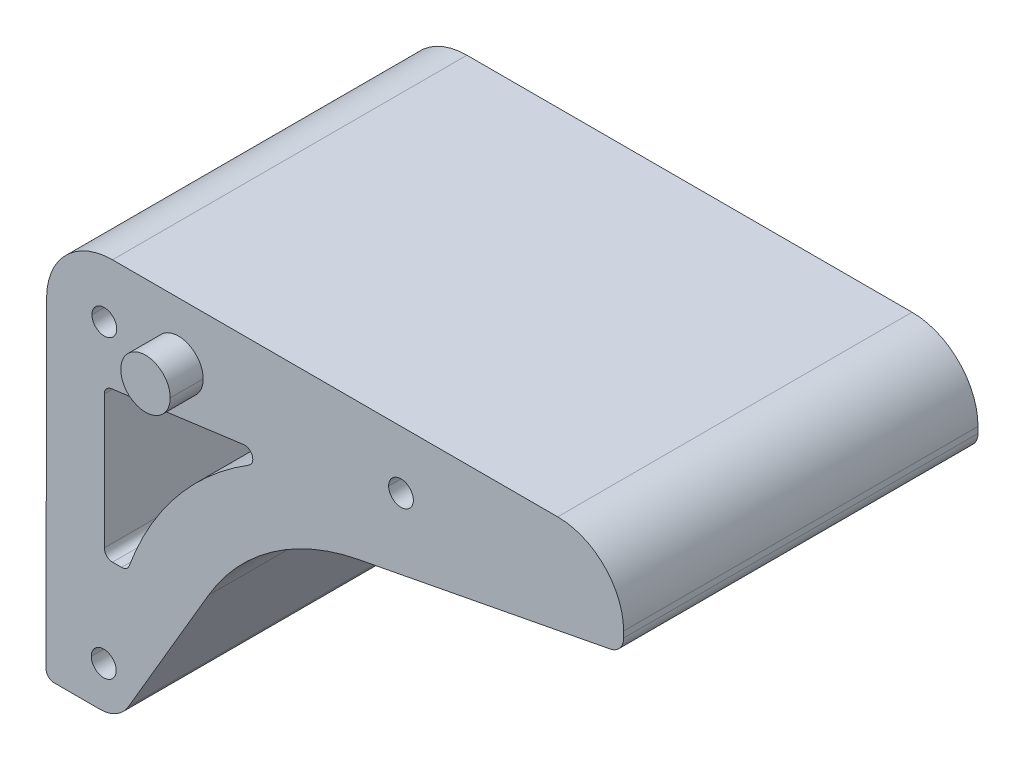
ISO-10303-21;
HEADER;
FILE_DESCRIPTION(('STEP AP214'),'2;1');
FILE_NAME('part.step','',(''),(''),'','','');
FILE_SCHEMA(('AUTOMOTIVE_DESIGN { 1 0 10303 214 1 1 1 1 }'));
ENDSEC;
DATA;
#1=APPLICATION_CONTEXT('core data for automotive mechanical design processes');
#2=APPLICATION_PROTOCOL_DEFINITION('international standard','automotive_design',2000,#1);
#3=PRODUCT_CONTEXT('',#1,'mechanical');
#4=PRODUCT('Part','Part','',(#3));
#5=PRODUCT_RELATED_PRODUCT_CATEGORY('part','',(#4));
#6=PRODUCT_DEFINITION_FORMATION('','',#4);
#7=PRODUCT_DEFINITION_CONTEXT('part definition',#1,'design');
#8=PRODUCT_DEFINITION('design','',#6,#7);
#9=PRODUCT_DEFINITION_SHAPE('','',#8);
#10=(LENGTH_UNIT() NAMED_UNIT(*) SI_UNIT(.MILLI.,.METRE.));
#11=(NAMED_UNIT(*) PLANE_ANGLE_UNIT() SI_UNIT($,.RADIAN.));
#12=(NAMED_UNIT(*) SI_UNIT($,.STERADIAN.) SOLID_ANGLE_UNIT());
#13=UNCERTAINTY_MEASURE_WITH_UNIT(LENGTH_MEASURE(1.E-05),#10,'distance_accuracy_value','');
#14=(GEOMETRIC_REPRESENTATION_CONTEXT(3) GLOBAL_UNCERTAINTY_ASSIGNED_CONTEXT((#13)) GLOBAL_UNIT_ASSIGNED_CONTEXT((#10,
#11,#12)) REPRESENTATION_CONTEXT('',''));
#15=CARTESIAN_POINT('',(0.,0.,0.));
#16=DIRECTION('',(0.,0.,1.));
#17=DIRECTION('',(1.,0.,0.));
#18=AXIS2_PLACEMENT_3D('',#15,#16,#17);
#19=CARTESIAN_POINT('',(9.,0.,47.));
#20=DIRECTION('',(0.,0.,-1.));
#21=DIRECTION('',(-1.,0.,0.));
#22=AXIS2_PLACEMENT_3D('',#19,#20,#21);
#23=CYLINDRICAL_SURFACE('',#22,3.);
#24=CARTESIAN_POINT('',(9.,0.,47.));
#25=DIRECTION('',(0.,0.,1.));
#26=DIRECTION('',(1.,0.,0.));
#27=AXIS2_PLACEMENT_3D('',#24,#25,#26);
#28=CIRCLE('',#27,3.);
#29=CARTESIAN_POINT('',(12.,0.,47.));
#30=VERTEX_POINT('',#29);
#31=CARTESIAN_POINT('',(6.,0.,47.));
#32=VERTEX_POINT('',#31);
#33=EDGE_CURVE('E42',#30,#32,#28,.T.);
#34=ORIENTED_EDGE('',*,*,#33,.F.);
#35=DIRECTION('',(0.,0.,-1.));
#36=VECTOR('',#35,1.);
#37=CARTESIAN_POINT('',(12.,0.,47.));
#38=LINE('',#37,#36);
#39=CARTESIAN_POINT('',(12.,0.,43.));
#40=VERTEX_POINT('',#39);
#41=EDGE_CURVE('E11',#30,#40,#38,.T.);
#42=ORIENTED_EDGE('',*,*,#41,.T.);
#43=CARTESIAN_POINT('',(9.,0.,43.));
#44=DIRECTION('',(0.,0.,1.));
#45=DIRECTION('',(1.,0.,0.));
#46=AXIS2_PLACEMENT_3D('',#43,#44,#45);
#47=CIRCLE('',#46,3.);
#48=CARTESIAN_POINT('',(6.,0.,43.));
#49=VERTEX_POINT('',#48);
#50=EDGE_CURVE('E28',#40,#49,#47,.T.);
#51=ORIENTED_EDGE('',*,*,#50,.T.);
#52=DIRECTION('',(0.,0.,-1.));
#53=VECTOR('',#52,1.);
#54=CARTESIAN_POINT('',(6.,0.,47.));
#55=LINE('',#54,#53);
#56=EDGE_CURVE('E438',#32,#49,#55,.T.);
#57=ORIENTED_EDGE('',*,*,#56,.F.);
#58=EDGE_LOOP('',(#34,#42,#51,#57));
#59=FACE_BOUND('',#58,.T.);
#60=ADVANCED_FACE('F17',(#59),#23,.T.);
#61=CARTESIAN_POINT('',(0.,0.,43.));
#62=DIRECTION('',(0.,0.,-1.));
#63=DIRECTION('',(-1.,0.,0.));
#64=AXIS2_PLACEMENT_3D('',#61,#62,#63);
#65=CYLINDRICAL_SURFACE('',#64,1.5);
#66=CARTESIAN_POINT('',(0.,0.,43.));
#67=DIRECTION('',(0.,0.,1.));
#68=DIRECTION('',(1.,0.,0.));
#69=AXIS2_PLACEMENT_3D('',#66,#67,#68);
#70=CIRCLE('',#69,1.5);
#71=CARTESIAN_POINT('',(-1.5,0.,43.));
#72=VERTEX_POINT('',#71);
#73=CARTESIAN_POINT('',(1.5,0.,43.));
#74=VERTEX_POINT('',#73);
#75=EDGE_CURVE('E500',#72,#74,#70,.T.);
#76=ORIENTED_EDGE('',*,*,#75,.T.);
#77=DIRECTION('',(0.,0.,-1.));
#78=VECTOR('',#77,1.);
#79=CARTESIAN_POINT('',(1.5,0.,43.));
#80=LINE('',#79,#78);
#81=CARTESIAN_POINT('',(1.5,0.,0.));
#82=VERTEX_POINT('',#81);
#83=EDGE_CURVE('E501',#74,#82,#80,.T.);
#84=ORIENTED_EDGE('',*,*,#83,.T.);
#85=CARTESIAN_POINT('',(0.,0.,0.));
#86=DIRECTION('',(0.,0.,1.));
#87=DIRECTION('',(1.,0.,0.));
#88=AXIS2_PLACEMENT_3D('',#85,#86,#87);
#89=CIRCLE('',#88,1.5);
#90=CARTESIAN_POINT('',(-1.5,0.,0.));
#91=VERTEX_POINT('',#90);
#92=EDGE_CURVE('E118',#91,#82,#89,.T.);
#93=ORIENTED_EDGE('',*,*,#92,.F.);
#94=DIRECTION('',(0.,0.,-1.));
#95=VECTOR('',#94,1.);
#96=CARTESIAN_POINT('',(-1.5,0.,43.));
#97=LINE('',#96,#95);
#98=EDGE_CURVE('E108',#72,#91,#97,.T.);
#99=ORIENTED_EDGE('',*,*,#98,.F.);
#100=EDGE_LOOP('',(#76,#84,#93,#99));
#101=FACE_BOUND('',#100,.T.);
#102=ADVANCED_FACE('F642',(#101),#65,.F.);
#103=CARTESIAN_POINT('',(36.0000004601256,0.,43.));
#104=DIRECTION('',(0.,0.,-1.));
#105=DIRECTION('',(-1.,0.,0.));
#106=AXIS2_PLACEMENT_3D('',#103,#104,#105);
#107=CYLINDRICAL_SURFACE('',#106,1.49999999590362);
#108=CARTESIAN_POINT('',(36.0000004601256,0.,43.));
#109=DIRECTION('',(0.,0.,1.));
#110=DIRECTION('',(1.,0.,0.));
#111=AXIS2_PLACEMENT_3D('',#108,#109,#110);
#112=CIRCLE('',#111,1.49999999590362);
#113=CARTESIAN_POINT('',(34.5000004642219,0.,43.));
#114=VERTEX_POINT('',#113);
#115=CARTESIAN_POINT('',(37.5000004560292,0.,43.));
#116=VERTEX_POINT('',#115);
#117=EDGE_CURVE('E483',#114,#116,#112,.T.);
#118=ORIENTED_EDGE('',*,*,#117,.T.);
#119=DIRECTION('',(0.,0.,-1.));
#120=VECTOR('',#119,1.);
#121=CARTESIAN_POINT('',(37.5000004560292,0.,43.));
#122=LINE('',#121,#120);
#123=CARTESIAN_POINT('',(37.5000004560292,0.,0.));
#124=VERTEX_POINT('',#123);
#125=EDGE_CURVE('E281',#116,#124,#122,.T.);
#126=ORIENTED_EDGE('',*,*,#125,.T.);
#127=CARTESIAN_POINT('',(36.0000004601256,0.,0.));
#128=DIRECTION('',(0.,0.,1.));
#129=DIRECTION('',(1.,0.,0.));
#130=AXIS2_PLACEMENT_3D('',#127,#128,#129);
#131=CIRCLE('',#130,1.49999999590362);
#132=CARTESIAN_POINT('',(34.5000004642219,0.,0.));
#133=VERTEX_POINT('',#132);
#134=EDGE_CURVE('E275',#133,#124,#131,.T.);
#135=ORIENTED_EDGE('',*,*,#134,.F.);
#136=DIRECTION('',(0.,0.,-1.));
#137=VECTOR('',#136,1.);
#138=CARTESIAN_POINT('',(34.5000004642219,0.,43.));
#139=LINE('',#138,#137);
#140=EDGE_CURVE('E279',#114,#133,#139,.T.);
#141=ORIENTED_EDGE('',*,*,#140,.F.);
#142=EDGE_LOOP('',(#118,#126,#135,#141));
#143=FACE_BOUND('',#142,.T.);
#144=ADVANCED_FACE('F278',(#143),#107,.F.);
#145=CARTESIAN_POINT('',(-0.0697449654830208,-35.9301191889808,43.));
#146=DIRECTION('',(0.,0.,-1.));
#147=DIRECTION('',(-1.,0.,0.));
#148=AXIS2_PLACEMENT_3D('',#145,#146,#147);
#149=CYLINDRICAL_SURFACE('',#148,1.50999950072135);
#150=CARTESIAN_POINT('',(-0.0697449654830208,-35.9301191889808,43.));
#151=DIRECTION('',(0.,0.,1.));
#152=DIRECTION('',(1.,0.,0.));
#153=AXIS2_PLACEMENT_3D('',#150,#151,#152);
#154=CIRCLE('',#153,1.50999950072135);
#155=CARTESIAN_POINT('',(-1.57974446620436,-35.9301191889808,43.));
#156=VERTEX_POINT('',#155);
#157=CARTESIAN_POINT('',(1.44025453523832,-35.9301191889808,43.));
#158=VERTEX_POINT('',#157);
#159=EDGE_CURVE('E464',#156,#158,#154,.T.);
#160=ORIENTED_EDGE('',*,*,#159,.T.);
#161=DIRECTION('',(0.,0.,-1.));
#162=VECTOR('',#161,1.);
#163=CARTESIAN_POINT('',(1.44025453523832,-35.9301191889808,43.));
#164=LINE('',#163,#162);
#165=CARTESIAN_POINT('',(1.44025453523832,-35.9301191889808,0.));
#166=VERTEX_POINT('',#165);
#167=EDGE_CURVE('E433',#158,#166,#164,.T.);
#168=ORIENTED_EDGE('',*,*,#167,.T.);
#169=CARTESIAN_POINT('',(-0.0697449654830208,-35.9301191889808,0.));
#170=DIRECTION('',(0.,0.,1.));
#171=DIRECTION('',(1.,0.,0.));
#172=AXIS2_PLACEMENT_3D('',#169,#170,#171);
#173=CIRCLE('',#172,1.50999950072135);
#174=CARTESIAN_POINT('',(-1.57974446620436,-35.9301191889808,0.));
#175=VERTEX_POINT('',#174);
#176=EDGE_CURVE('E300',#175,#166,#173,.T.);
#177=ORIENTED_EDGE('',*,*,#176,.F.);
#178=DIRECTION('',(0.,0.,-1.));
#179=VECTOR('',#178,1.);
#180=CARTESIAN_POINT('',(-1.57974446620436,-35.9301191889808,43.));
#181=LINE('',#180,#179);
#182=EDGE_CURVE('E459',#156,#175,#181,.T.);
#183=ORIENTED_EDGE('',*,*,#182,.F.);
#184=EDGE_LOOP('',(#160,#168,#177,#183));
#185=FACE_BOUND('',#184,.T.);
#186=ADVANCED_FACE('F621',(#185),#149,.F.);
#187=CARTESIAN_POINT('',(0.,-40.98440696688,43.));
#188=DIRECTION('',(0.,1.,0.));
#189=DIRECTION('',(1.,0.,0.));
#190=AXIS2_PLACEMENT_3D('',#187,#188,#189);
#191=PLANE('',#190);
#192=DIRECTION('',(1.,0.,0.));
#193=VECTOR('',#192,1.);
#194=CARTESIAN_POINT('',(0.,-40.98440696688,0.));
#195=LINE('',#194,#193);
#196=CARTESIAN_POINT('',(-6.07374896431716,-40.98440696688,0.));
#197=VERTEX_POINT('',#196);
#198=CARTESIAN_POINT('',(-0.538759411870727,-40.98440696688,0.));
#199=VERTEX_POINT('',#198);
#200=EDGE_CURVE('E429',#197,#199,#195,.T.);
#201=ORIENTED_EDGE('',*,*,#200,.T.);
#202=DIRECTION('',(0.,0.,-1.));
#203=VECTOR('',#202,1.);
#204=CARTESIAN_POINT('',(-0.538759411870727,-40.98440696688,43.));
#205=LINE('',#204,#203);
#206=CARTESIAN_POINT('',(-0.538759411870727,-40.98440696688,43.));
#207=VERTEX_POINT('',#206);
#208=EDGE_CURVE('E445',#207,#199,#205,.T.);
#209=ORIENTED_EDGE('',*,*,#208,.F.);
#210=DIRECTION('',(1.,0.,0.));
#211=VECTOR('',#210,1.);
#212=CARTESIAN_POINT('',(0.,-40.98440696688,43.));
#213=LINE('',#212,#211);
#214=CARTESIAN_POINT('',(-6.07374896431716,-40.98440696688,43.));
#215=VERTEX_POINT('',#214);
#216=EDGE_CURVE('E324',#215,#207,#213,.T.);
#217=ORIENTED_EDGE('',*,*,#216,.F.);
#218=DIRECTION('',(0.,0.,-1.));
#219=VECTOR('',#218,1.);
#220=CARTESIAN_POINT('',(-6.07374896431716,-40.98440696688,43.));
#221=LINE('',#220,#219);
#222=EDGE_CURVE('E434',#215,#197,#221,.T.);
#223=ORIENTED_EDGE('',*,*,#222,.T.);
#224=EDGE_LOOP('',(#201,#209,#217,#223));
#225=FACE_BOUND('',#224,.T.);
#226=ADVANCED_FACE('F649',(#225),#191,.F.);
#227=CARTESIAN_POINT('',(-0.538759411870727,-36.98440696688,43.));
#228=DIRECTION('',(0.,0.,-1.));
#229=DIRECTION('',(-1.,0.,0.));
#230=AXIS2_PLACEMENT_3D('',#227,#228,#229);
#231=CYLINDRICAL_SURFACE('',#230,4.);
#232=CARTESIAN_POINT('',(-0.538759411870727,-36.98440696688,0.));
#233=DIRECTION('',(0.,0.,1.));
#234=DIRECTION('',(1.,0.,0.));
#235=AXIS2_PLACEMENT_3D('',#232,#233,#234);
#236=CIRCLE('',#235,4.);
#237=CARTESIAN_POINT('',(2.91214357730584,-39.0070954152804,0.));
#238=VERTEX_POINT('',#237);
#239=EDGE_CURVE('E471',#199,#238,#236,.T.);
#240=ORIENTED_EDGE('',*,*,#239,.T.);
#241=DIRECTION('',(0.,0.,-1.));
#242=VECTOR('',#241,1.);
#243=CARTESIAN_POINT('',(2.91214357730584,-39.0070954152804,43.));
#244=LINE('',#243,#242);
#245=CARTESIAN_POINT('',(2.91214357730584,-39.0070954152804,43.));
#246=VERTEX_POINT('',#245);
#247=EDGE_CURVE('E359',#246,#238,#244,.T.);
#248=ORIENTED_EDGE('',*,*,#247,.F.);
#249=CARTESIAN_POINT('',(-0.538759411870727,-36.98440696688,43.));
#250=DIRECTION('',(0.,0.,1.));
#251=DIRECTION('',(1.,0.,0.));
#252=AXIS2_PLACEMENT_3D('',#249,#250,#251);
#253=CIRCLE('',#252,4.);
#254=EDGE_CURVE('E328',#207,#246,#253,.T.);
#255=ORIENTED_EDGE('',*,*,#254,.F.);
#256=ORIENTED_EDGE('',*,*,#208,.T.);
#257=EDGE_LOOP('',(#240,#248,#255,#256));
#258=FACE_BOUND('',#257,.T.);
#259=ADVANCED_FACE('F19',(#258),#231,.T.);
#260=CARTESIAN_POINT('',(19.1845890872568,-11.244722571399,43.));
#261=DIRECTION('',(0.862725747294141,-0.505672112100089,0.));
#262=DIRECTION('',(0.,0.,-1.));
#263=AXIS2_PLACEMENT_3D('',#260,#261,#262);
#264=PLANE('',#263);
#265=DIRECTION('',(-0.505672112100089,-0.862725747294141,0.));
#266=VECTOR('',#265,1.);
#267=CARTESIAN_POINT('',(19.1845890872568,-11.244722571399,0.));
#268=LINE('',#267,#266);
#269=CARTESIAN_POINT('',(12.6364018175907,-22.4165661840174,0.));
#270=VERTEX_POINT('',#269);
#271=EDGE_CURVE('E412',#270,#238,#268,.T.);
#272=ORIENTED_EDGE('',*,*,#271,.F.);
#273=DIRECTION('',(0.,0.,-1.));
#274=VECTOR('',#273,1.);
#275=CARTESIAN_POINT('',(12.6364018175907,-22.4165661840174,43.));
#276=LINE('',#275,#274);
#277=CARTESIAN_POINT('',(12.6364018175907,-22.4165661840174,43.));
#278=VERTEX_POINT('',#277);
#279=EDGE_CURVE('E345',#278,#270,#276,.T.);
#280=ORIENTED_EDGE('',*,*,#279,.F.);
#281=DIRECTION('',(-0.505672112100089,-0.862725747294141,0.));
#282=VECTOR('',#281,1.);
#283=CARTESIAN_POINT('',(19.1845890872568,-11.244722571399,43.));
#284=LINE('',#283,#282);
#285=EDGE_CURVE('E362',#278,#246,#284,.T.);
#286=ORIENTED_EDGE('',*,*,#285,.T.);
#287=ORIENTED_EDGE('',*,*,#247,.T.);
#288=EDGE_LOOP('',(#272,#280,#286,#287));
#289=FACE_BOUND('',#288,.T.);
#290=ADVANCED_FACE('F654',(#289),#264,.T.);
#291=CARTESIAN_POINT('',(35.9300519562595,-36.069745425607,43.));
#292=DIRECTION('',(0.,0.,-1.));
#293=DIRECTION('',(-1.,0.,0.));
#294=AXIS2_PLACEMENT_3D('',#291,#292,#293);
#295=CYLINDRICAL_SURFACE('',#294,27.0000637070669);
#296=CARTESIAN_POINT('',(35.9300519562595,-36.069745425607,0.));
#297=DIRECTION('',(0.,0.,1.));
#298=DIRECTION('',(1.,0.,0.));
#299=AXIS2_PLACEMENT_3D('',#296,#297,#298);
#300=CIRCLE('',#299,27.0000637070669);
#301=CARTESIAN_POINT('',(30.8419377227415,-9.55343848568145,0.));
#302=VERTEX_POINT('',#301);
#303=EDGE_CURVE('E420',#302,#270,#300,.T.);
#304=ORIENTED_EDGE('',*,*,#303,.F.);
#305=DIRECTION('',(0.,0.,-1.));
#306=VECTOR('',#305,1.);
#307=CARTESIAN_POINT('',(30.8419377227415,-9.55343848568145,43.));
#308=LINE('',#307,#306);
#309=CARTESIAN_POINT('',(30.8419377227415,-9.55343848568145,43.));
#310=VERTEX_POINT('',#309);
#311=EDGE_CURVE('E316',#310,#302,#308,.T.);
#312=ORIENTED_EDGE('',*,*,#311,.F.);
#313=CARTESIAN_POINT('',(35.9300519562595,-36.069745425607,43.));
#314=DIRECTION('',(0.,0.,1.));
#315=DIRECTION('',(1.,0.,0.));
#316=AXIS2_PLACEMENT_3D('',#313,#314,#315);
#317=CIRCLE('',#316,27.0000637070669);
#318=EDGE_CURVE('E363',#310,#278,#317,.T.);
#319=ORIENTED_EDGE('',*,*,#318,.T.);
#320=ORIENTED_EDGE('',*,*,#279,.T.);
#321=EDGE_LOOP('',(#304,#312,#319,#320));
#322=FACE_BOUND('',#321,.T.);
#323=ADVANCED_FACE('F651',(#322),#295,.F.);
#324=CARTESIAN_POINT('',(2.86335389828852,-14.9221435211676,43.));
#325=DIRECTION('',(0.188448230667923,-0.982083124973711,0.));
#326=DIRECTION('',(0.,0.,-1.));
#327=AXIS2_PLACEMENT_3D('',#324,#325,#326);
#328=PLANE('',#327);
#329=DIRECTION('',(-0.982083124973711,-0.188448230667923,0.));
#330=VECTOR('',#329,1.);
#331=CARTESIAN_POINT('',(2.86335389828852,-14.9221435211676,0.));
#332=LINE('',#331,#330);
#333=CARTESIAN_POINT('',(61.3904172501601,-3.69160584631968,0.));
#334=VERTEX_POINT('',#333);
#335=EDGE_CURVE('E424',#334,#302,#332,.T.);
#336=ORIENTED_EDGE('',*,*,#335,.F.);
#337=DIRECTION('',(0.,0.,-1.));
#338=VECTOR('',#337,1.);
#339=CARTESIAN_POINT('',(61.3904172501601,-3.69160584631968,43.));
#340=LINE('',#339,#338);
#341=CARTESIAN_POINT('',(61.3904172501601,-3.69160584631968,43.));
#342=VERTEX_POINT('',#341);
#343=EDGE_CURVE('E317',#342,#334,#340,.T.);
#344=ORIENTED_EDGE('',*,*,#343,.F.);
#345=DIRECTION('',(-0.982083124973711,-0.188448230667923,0.));
#346=VECTOR('',#345,1.);
#347=CARTESIAN_POINT('',(2.86335389828852,-14.9221435211676,43.));
#348=LINE('',#347,#346);
#349=EDGE_CURVE('E341',#342,#310,#348,.T.);
#350=ORIENTED_EDGE('',*,*,#349,.T.);
#351=ORIENTED_EDGE('',*,*,#311,.T.);
#352=EDGE_LOOP('',(#336,#344,#350,#351));
#353=FACE_BOUND('',#352,.T.);
#354=ADVANCED_FACE('F653',(#353),#328,.T.);
#355=CARTESIAN_POINT('',(61.0135207888242,-1.72743959637227,43.));
#356=DIRECTION('',(0.,0.,-1.));
#357=DIRECTION('',(-1.,0.,0.));
#358=AXIS2_PLACEMENT_3D('',#355,#356,#357);
#359=CYLINDRICAL_SURFACE('',#358,2.);
#360=CARTESIAN_POINT('',(61.0135207888242,-1.72743959637227,0.));
#361=DIRECTION('',(0.,0.,1.));
#362=DIRECTION('',(1.,0.,0.));
#363=AXIS2_PLACEMENT_3D('',#360,#361,#362);
#364=CIRCLE('',#363,2.);
#365=CARTESIAN_POINT('',(63.0135207888242,-1.72743959637227,0.));
#366=VERTEX_POINT('',#365);
#367=EDGE_CURVE('E313',#334,#366,#364,.T.);
#368=ORIENTED_EDGE('',*,*,#367,.T.);
#369=DIRECTION('',(0.,0.,-1.));
#370=VECTOR('',#369,1.);
#371=CARTESIAN_POINT('',(63.0135207888242,-1.72743959637227,43.));
#372=LINE('',#371,#370);
#373=CARTESIAN_POINT('',(63.0135207888242,-1.72743959637227,43.));
#374=VERTEX_POINT('',#373);
#375=EDGE_CURVE('E346',#374,#366,#372,.T.);
#376=ORIENTED_EDGE('',*,*,#375,.F.);
#377=CARTESIAN_POINT('',(61.0135207888242,-1.72743959637227,43.));
#378=DIRECTION('',(0.,0.,1.));
#379=DIRECTION('',(1.,0.,0.));
#380=AXIS2_PLACEMENT_3D('',#377,#378,#379);
#381=CIRCLE('',#380,2.);
#382=EDGE_CURVE('E337',#342,#374,#381,.T.);
#383=ORIENTED_EDGE('',*,*,#382,.F.);
#384=ORIENTED_EDGE('',*,*,#343,.T.);
#385=EDGE_LOOP('',(#368,#376,#383,#384));
#386=FACE_BOUND('',#385,.T.);
#387=ADVANCED_FACE('F660',(#386),#359,.T.);
#388=CARTESIAN_POINT('',(63.0135207888242,-1.1801435762291E-12,43.));
#389=DIRECTION('',(1.,0.,0.));
#390=DIRECTION('',(0.,-1.,0.));
#391=AXIS2_PLACEMENT_3D('',#388,#389,#390);
#392=PLANE('',#391);
#393=DIRECTION('',(0.,-1.,0.));
#394=VECTOR('',#393,1.);
#395=CARTESIAN_POINT('',(63.0135207888242,-1.1801435762291E-12,0.));
#396=LINE('',#395,#394);
#397=CARTESIAN_POINT('',(63.0135207888242,-0.986438002884081,0.));
#398=VERTEX_POINT('',#397);
#399=EDGE_CURVE('E379',#398,#366,#396,.T.);
#400=ORIENTED_EDGE('',*,*,#399,.F.);
#401=DIRECTION('',(0.,0.,-1.));
#402=VECTOR('',#401,1.);
#403=CARTESIAN_POINT('',(63.0135207888242,-0.986438002884081,43.));
#404=LINE('',#403,#402);
#405=CARTESIAN_POINT('',(63.0135207888242,-0.986438002884081,43.));
#406=VERTEX_POINT('',#405);
#407=EDGE_CURVE('E351',#406,#398,#404,.T.);
#408=ORIENTED_EDGE('',*,*,#407,.F.);
#409=DIRECTION('',(0.,-1.,0.));
#410=VECTOR('',#409,1.);
#411=CARTESIAN_POINT('',(63.0135207888242,-1.1801435762291E-12,43.));
#412=LINE('',#411,#410);
#413=EDGE_CURVE('E349',#406,#374,#412,.T.);
#414=ORIENTED_EDGE('',*,*,#413,.T.);
#415=ORIENTED_EDGE('',*,*,#375,.T.);
#416=EDGE_LOOP('',(#400,#408,#414,#415));
#417=FACE_BOUND('',#416,.T.);
#418=ADVANCED_FACE('F865',(#417),#392,.T.);
#419=CARTESIAN_POINT('',(55.0135207888242,-0.986438002884082,43.));
#420=DIRECTION('',(0.,0.,-1.));
#421=DIRECTION('',(-1.,0.,0.));
#422=AXIS2_PLACEMENT_3D('',#419,#420,#421);
#423=CYLINDRICAL_SURFACE('',#422,8.);
#424=CARTESIAN_POINT('',(55.0135207888242,-0.986438002884082,0.));
#425=DIRECTION('',(0.,0.,1.));
#426=DIRECTION('',(1.,0.,0.));
#427=AXIS2_PLACEMENT_3D('',#424,#425,#426);
#428=CIRCLE('',#427,8.);
#429=CARTESIAN_POINT('',(55.0135207888242,7.01356199711592,0.));
#430=VERTEX_POINT('',#429);
#431=EDGE_CURVE('E350',#398,#430,#428,.T.);
#432=ORIENTED_EDGE('',*,*,#431,.T.);
#433=DIRECTION('',(0.,0.,-1.));
#434=VECTOR('',#433,1.);
#435=CARTESIAN_POINT('',(55.0135207888242,7.01356199711592,43.));
#436=LINE('',#435,#434);
#437=CARTESIAN_POINT('',(55.0135207888242,7.01356199711592,43.));
#438=VERTEX_POINT('',#437);
#439=EDGE_CURVE('E428',#438,#430,#436,.T.);
#440=ORIENTED_EDGE('',*,*,#439,.F.);
#441=CARTESIAN_POINT('',(55.0135207888242,-0.986438002884082,43.));
#442=DIRECTION('',(0.,0.,1.));
#443=DIRECTION('',(1.,0.,0.));
#444=AXIS2_PLACEMENT_3D('',#441,#442,#443);
#445=CIRCLE('',#444,8.);
#446=EDGE_CURVE('E487',#406,#438,#445,.T.);
#447=ORIENTED_EDGE('',*,*,#446,.F.);
#448=ORIENTED_EDGE('',*,*,#407,.T.);
#449=EDGE_LOOP('',(#432,#440,#447,#448));
#450=FACE_BOUND('',#449,.T.);
#451=ADVANCED_FACE('F994',(#450),#423,.T.);
#452=CARTESIAN_POINT('',(0.,7.01356199711592,43.));
#453=DIRECTION('',(0.,1.,0.));
#454=DIRECTION('',(1.,0.,0.));
#455=AXIS2_PLACEMENT_3D('',#452,#453,#454);
#456=PLANE('',#455);
#457=DIRECTION('',(1.,0.,0.));
#458=VECTOR('',#457,1.);
#459=CARTESIAN_POINT('',(0.,7.01356199711592,0.));
#460=LINE('',#459,#458);
#461=CARTESIAN_POINT('',(0.998014646345751,7.01356199711592,0.));
#462=VERTEX_POINT('',#461);
#463=EDGE_CURVE('E374',#462,#430,#460,.T.);
#464=ORIENTED_EDGE('',*,*,#463,.F.);
#465=DIRECTION('',(0.,0.,-1.));
#466=VECTOR('',#465,1.);
#467=CARTESIAN_POINT('',(0.998014646345751,7.01356199711592,43.));
#468=LINE('',#467,#466);
#469=CARTESIAN_POINT('',(0.998014646345751,7.01356199711592,43.));
#470=VERTEX_POINT('',#469);
#471=EDGE_CURVE('E390',#470,#462,#468,.T.);
#472=ORIENTED_EDGE('',*,*,#471,.F.);
#473=DIRECTION('',(1.,0.,0.));
#474=VECTOR('',#473,1.);
#475=CARTESIAN_POINT('',(0.,7.01356199711592,43.));
#476=LINE('',#475,#474);
#477=EDGE_CURVE('E355',#470,#438,#476,.T.);
#478=ORIENTED_EDGE('',*,*,#477,.T.);
#479=ORIENTED_EDGE('',*,*,#439,.T.);
#480=EDGE_LOOP('',(#464,#472,#478,#479));
#481=FACE_BOUND('',#480,.T.);
#482=ADVANCED_FACE('F985',(#481),#456,.T.);
#483=CARTESIAN_POINT('',(0.998014646345751,-0.986438002884081,43.));
#484=DIRECTION('',(0.,0.,-1.));
#485=DIRECTION('',(-1.,0.,0.));
#486=AXIS2_PLACEMENT_3D('',#483,#484,#485);
#487=CYLINDRICAL_SURFACE('',#486,8.);
#488=CARTESIAN_POINT('',(0.998014646345751,-0.986438002884081,0.));
#489=DIRECTION('',(0.,0.,-1.));
#490=DIRECTION('',(1.,0.,0.));
#491=AXIS2_PLACEMENT_3D('',#488,#489,#490);
#492=CIRCLE('',#491,8.);
#493=CARTESIAN_POINT('',(-7.00197031082687,-0.970923976591617,0.));
#494=VERTEX_POINT('',#493);
#495=EDGE_CURVE('E378',#494,#462,#492,.T.);
#496=ORIENTED_EDGE('',*,*,#495,.F.);
#497=DIRECTION('',(0.,0.,-1.));
#498=VECTOR('',#497,1.);
#499=CARTESIAN_POINT('',(-7.00197031082687,-0.970923976591617,43.));
#500=LINE('',#499,#498);
#501=CARTESIAN_POINT('',(-7.00197031082687,-0.970923976591617,43.));
#502=VERTEX_POINT('',#501);
#503=EDGE_CURVE('E537',#502,#494,#500,.T.);
#504=ORIENTED_EDGE('',*,*,#503,.F.);
#505=CARTESIAN_POINT('',(0.998014646345751,-0.986438002884081,43.));
#506=DIRECTION('',(0.,0.,-1.));
#507=DIRECTION('',(1.,0.,0.));
#508=AXIS2_PLACEMENT_3D('',#505,#506,#507);
#509=CIRCLE('',#508,8.);
#510=EDGE_CURVE('E394',#502,#470,#509,.T.);
#511=ORIENTED_EDGE('',*,*,#510,.T.);
#512=ORIENTED_EDGE('',*,*,#471,.T.);
#513=EDGE_LOOP('',(#496,#504,#511,#512));
#514=FACE_BOUND('',#513,.T.);
#515=ADVANCED_FACE('F976',(#514),#487,.T.);
#516=CARTESIAN_POINT('',(-7.0000611145218,0.013574917048082,43.));
#517=DIRECTION('',(0.999998119646578,-0.00193925328655758,0.));
#518=DIRECTION('',(0.,0.,-1.));
#519=AXIS2_PLACEMENT_3D('',#516,#517,#518);
#520=PLANE('',#519);
#521=DIRECTION('',(-0.00193925328655758,-0.999998119646577,0.));
#522=VECTOR('',#521,1.);
#523=CARTESIAN_POINT('',(-7.0000611145218,0.013574917048082,0.));
#524=LINE('',#523,#522);
#525=CARTESIAN_POINT('',(-7.07374896431716,-37.9844069532189,0.));
#526=VERTEX_POINT('',#525);
#527=EDGE_CURVE('E395',#494,#526,#524,.T.);
#528=ORIENTED_EDGE('',*,*,#527,.T.);
#529=DIRECTION('',(0.,0.,-1.));
#530=VECTOR('',#529,1.);
#531=CARTESIAN_POINT('',(-7.07374896431716,-37.9844069532189,43.));
#532=LINE('',#531,#530);
#533=CARTESIAN_POINT('',(-7.07374896431716,-37.9844069532189,43.));
#534=VERTEX_POINT('',#533);
#535=EDGE_CURVE('E380',#534,#526,#532,.T.);
#536=ORIENTED_EDGE('',*,*,#535,.F.);
#537=DIRECTION('',(-0.00193925328655758,-0.999998119646577,0.));
#538=VECTOR('',#537,1.);
#539=CARTESIAN_POINT('',(-7.0000611145218,0.013574917048082,43.));
#540=LINE('',#539,#538);
#541=EDGE_CURVE('E490',#502,#534,#540,.T.);
#542=ORIENTED_EDGE('',*,*,#541,.F.);
#543=ORIENTED_EDGE('',*,*,#503,.T.);
#544=EDGE_LOOP('',(#528,#536,#542,#543));
#545=FACE_BOUND('',#544,.T.);
#546=ADVANCED_FACE('F850',(#545),#520,.F.);
#547=CARTESIAN_POINT('',(-7.07374896431716,0.,43.));
#548=DIRECTION('',(1.,0.,0.));
#549=DIRECTION('',(0.,1.,0.));
#550=AXIS2_PLACEMENT_3D('',#547,#548,#549);
#551=PLANE('',#550);
#552=DIRECTION('',(0.,-1.,0.));
#553=VECTOR('',#552,1.);
#554=CARTESIAN_POINT('',(-7.07374896431716,0.,0.));
#555=LINE('',#554,#553);
#556=CARTESIAN_POINT('',(-7.07374896431716,-39.98440696688,0.));
#557=VERTEX_POINT('',#556);
#558=EDGE_CURVE('E383',#526,#557,#555,.T.);
#559=ORIENTED_EDGE('',*,*,#558,.T.);
#560=DIRECTION('',(0.,0.,-1.));
#561=VECTOR('',#560,1.);
#562=CARTESIAN_POINT('',(-7.07374896431716,-39.98440696688,43.));
#563=LINE('',#562,#561);
#564=CARTESIAN_POINT('',(-7.07374896431716,-39.98440696688,43.));
#565=VERTEX_POINT('',#564);
#566=EDGE_CURVE('E327',#565,#557,#563,.T.);
#567=ORIENTED_EDGE('',*,*,#566,.F.);
#568=DIRECTION('',(0.,-1.,0.));
#569=VECTOR('',#568,1.);
#570=CARTESIAN_POINT('',(-7.07374896431716,0.,43.));
#571=LINE('',#570,#569);
#572=EDGE_CURVE('E496',#534,#565,#571,.T.);
#573=ORIENTED_EDGE('',*,*,#572,.F.);
#574=ORIENTED_EDGE('',*,*,#535,.T.);
#575=EDGE_LOOP('',(#559,#567,#573,#574));
#576=FACE_BOUND('',#575,.T.);
#577=ADVANCED_FACE('F845',(#576),#551,.F.);
#578=CARTESIAN_POINT('',(17.0155598717279,-5.43900954906084,43.));
#579=DIRECTION('',(0.,0.,-1.));
#580=DIRECTION('',(-1.,0.,0.));
#581=AXIS2_PLACEMENT_3D('',#578,#579,#580);
#582=CYLINDRICAL_SURFACE('',#581,1.);
#583=CARTESIAN_POINT('',(17.0155598717279,-5.43900954906084,0.));
#584=DIRECTION('',(0.,0.,1.));
#585=DIRECTION('',(1.,0.,0.));
#586=AXIS2_PLACEMENT_3D('',#583,#584,#585);
#587=CIRCLE('',#586,1.);
#588=CARTESIAN_POINT('',(17.5409624314246,-6.28986332631297,0.));
#589=VERTEX_POINT('',#588);
#590=CARTESIAN_POINT('',(16.8826591242759,-4.44788019760025,0.));
#591=VERTEX_POINT('',#590);
#592=EDGE_CURVE('E364',#589,#591,#587,.T.);
#593=ORIENTED_EDGE('',*,*,#592,.F.);
#594=DIRECTION('',(0.,0.,-1.));
#595=VECTOR('',#594,1.);
#596=CARTESIAN_POINT('',(17.5409624314246,-6.28986332631297,43.));
#597=LINE('',#596,#595);
#598=CARTESIAN_POINT('',(17.5409624314246,-6.28986332631297,43.));
#599=VERTEX_POINT('',#598);
#600=EDGE_CURVE('E404',#599,#589,#597,.T.);
#601=ORIENTED_EDGE('',*,*,#600,.F.);
#602=CARTESIAN_POINT('',(17.0155598717279,-5.43900954906084,43.));
#603=DIRECTION('',(0.,0.,1.));
#604=DIRECTION('',(1.,0.,0.));
#605=AXIS2_PLACEMENT_3D('',#602,#603,#604);
#606=CIRCLE('',#605,1.);
#607=CARTESIAN_POINT('',(16.8826591242759,-4.44788019760025,43.));
#608=VERTEX_POINT('',#607);
#609=EDGE_CURVE('E384',#599,#608,#606,.T.);
#610=ORIENTED_EDGE('',*,*,#609,.T.);
#611=DIRECTION('',(0.,0.,-1.));
#612=VECTOR('',#611,1.);
#613=CARTESIAN_POINT('',(16.8826591242759,-4.44788019760025,43.));
#614=LINE('',#613,#612);
#615=EDGE_CURVE('E522',#608,#591,#614,.T.);
#616=ORIENTED_EDGE('',*,*,#615,.T.);
#617=EDGE_LOOP('',(#593,#601,#610,#616));
#618=FACE_BOUND('',#617,.T.);
#619=ADVANCED_FACE('F849',(#618),#582,.F.);
#620=CARTESIAN_POINT('',(35.9300519562595,-36.069745425607,43.));
#621=DIRECTION('',(0.,0.,-1.));
#622=DIRECTION('',(-1.,0.,0.));
#623=AXIS2_PLACEMENT_3D('',#620,#621,#622);
#624=CYLINDRICAL_SURFACE('',#623,34.9999998771464);
#625=CARTESIAN_POINT('',(35.9300519562595,-36.069745425607,0.));
#626=DIRECTION('',(0.,0.,-1.));
#627=DIRECTION('',(1.,0.,0.));
#628=AXIS2_PLACEMENT_3D('',#625,#626,#627);
#629=CIRCLE('',#628,34.9999998771464);
#630=CARTESIAN_POINT('',(3.0415567728144,-24.0969898543629,0.));
#631=VERTEX_POINT('',#630);
#632=EDGE_CURVE('E370',#631,#589,#629,.T.);
#633=ORIENTED_EDGE('',*,*,#632,.F.);
#634=DIRECTION('',(0.,0.,-1.));
#635=VECTOR('',#634,1.);
#636=CARTESIAN_POINT('',(3.0415567728144,-24.0969898543629,43.));
#637=LINE('',#636,#635);
#638=CARTESIAN_POINT('',(3.0415567728144,-24.0969898543629,43.));
#639=VERTEX_POINT('',#638);
#640=EDGE_CURVE('E507',#639,#631,#637,.T.);
#641=ORIENTED_EDGE('',*,*,#640,.F.);
#642=CARTESIAN_POINT('',(35.9300519562595,-36.069745425607,43.));
#643=DIRECTION('',(0.,0.,-1.));
#644=DIRECTION('',(1.,0.,0.));
#645=AXIS2_PLACEMENT_3D('',#642,#643,#644);
#646=CIRCLE('',#645,34.9999998771464);
#647=EDGE_CURVE('E408',#639,#599,#646,.T.);
#648=ORIENTED_EDGE('',*,*,#647,.T.);
#649=ORIENTED_EDGE('',*,*,#600,.T.);
#650=EDGE_LOOP('',(#633,#641,#648,#649));
#651=FACE_BOUND('',#650,.T.);
#652=ADVANCED_FACE('F547',(#651),#624,.T.);
#653=CARTESIAN_POINT('',(2.10188547856048,-23.7549111225552,43.));
#654=DIRECTION('',(0.,0.,-1.));
#655=DIRECTION('',(-1.,0.,0.));
#656=AXIS2_PLACEMENT_3D('',#653,#654,#655);
#657=CYLINDRICAL_SURFACE('',#656,1.);
#658=CARTESIAN_POINT('',(2.10188547856048,-23.7549111225552,0.));
#659=DIRECTION('',(0.,0.,1.));
#660=DIRECTION('',(1.,0.,0.));
#661=AXIS2_PLACEMENT_3D('',#658,#659,#660);
#662=CIRCLE('',#661,1.);
#663=CARTESIAN_POINT('',(2.10188547856048,-24.7549111225552,0.));
#664=VERTEX_POINT('',#663);
#665=EDGE_CURVE('E323',#664,#631,#662,.T.);
#666=ORIENTED_EDGE('',*,*,#665,.F.);
#667=DIRECTION('',(0.,0.,-1.));
#668=VECTOR('',#667,1.);
#669=CARTESIAN_POINT('',(2.10188547856048,-24.7549111225552,43.));
#670=LINE('',#669,#668);
#671=CARTESIAN_POINT('',(2.10188547856048,-24.7549111225552,43.));
#672=VERTEX_POINT('',#671);
#673=EDGE_CURVE('E396',#672,#664,#670,.T.);
#674=ORIENTED_EDGE('',*,*,#673,.F.);
#675=CARTESIAN_POINT('',(2.10188547856048,-23.7549111225552,43.));
#676=DIRECTION('',(0.,0.,1.));
#677=DIRECTION('',(1.,0.,0.));
#678=AXIS2_PLACEMENT_3D('',#675,#676,#677);
#679=CIRCLE('',#678,1.);
#680=EDGE_CURVE('E409',#672,#639,#679,.T.);
#681=ORIENTED_EDGE('',*,*,#680,.T.);
#682=ORIENTED_EDGE('',*,*,#640,.T.);
#683=EDGE_LOOP('',(#666,#674,#681,#682));
#684=FACE_BOUND('',#683,.T.);
#685=ADVANCED_FACE('F555',(#684),#657,.F.);
#686=CARTESIAN_POINT('',(0.,-24.7549111225552,43.));
#687=DIRECTION('',(0.,1.,0.));
#688=DIRECTION('',(1.,0.,0.));
#689=AXIS2_PLACEMENT_3D('',#686,#687,#688);
#690=PLANE('',#689);
#691=DIRECTION('',(1.,0.,0.));
#692=VECTOR('',#691,1.);
#693=CARTESIAN_POINT('',(0.,-24.7549111225552,0.));
#694=LINE('',#693,#692);
#695=CARTESIAN_POINT('',(1.,-24.7549111225552,0.));
#696=VERTEX_POINT('',#695);
#697=EDGE_CURVE('E318',#696,#664,#694,.T.);
#698=ORIENTED_EDGE('',*,*,#697,.F.);
#699=DIRECTION('',(0.,0.,-1.));
#700=VECTOR('',#699,1.);
#701=CARTESIAN_POINT('',(1.,-24.7549111225552,43.));
#702=LINE('',#701,#700);
#703=CARTESIAN_POINT('',(1.,-24.7549111225552,43.));
#704=VERTEX_POINT('',#703);
#705=EDGE_CURVE('E385',#704,#696,#702,.T.);
#706=ORIENTED_EDGE('',*,*,#705,.F.);
#707=DIRECTION('',(1.,0.,0.));
#708=VECTOR('',#707,1.);
#709=CARTESIAN_POINT('',(0.,-24.7549111225552,43.));
#710=LINE('',#709,#708);
#711=EDGE_CURVE('E400',#704,#672,#710,.T.);
#712=ORIENTED_EDGE('',*,*,#711,.T.);
#713=ORIENTED_EDGE('',*,*,#673,.T.);
#714=EDGE_LOOP('',(#698,#706,#712,#713));
#715=FACE_BOUND('',#714,.T.);
#716=ADVANCED_FACE('F918',(#715),#690,.T.);
#717=CARTESIAN_POINT('',(1.,-23.7549111225552,43.));
#718=DIRECTION('',(0.,0.,-1.));
#719=DIRECTION('',(-1.,0.,0.));
#720=AXIS2_PLACEMENT_3D('',#717,#718,#719);
#721=CYLINDRICAL_SURFACE('',#720,1.);
#722=CARTESIAN_POINT('',(1.,-23.7549111225552,0.));
#723=DIRECTION('',(0.,0.,-1.));
#724=DIRECTION('',(1.,0.,0.));
#725=AXIS2_PLACEMENT_3D('',#722,#723,#724);
#726=CIRCLE('',#725,1.);
#727=CARTESIAN_POINT('',(0.,-23.7549111225552,0.));
#728=VERTEX_POINT('',#727);
#729=EDGE_CURVE('E21',#696,#728,#726,.T.);
#730=ORIENTED_EDGE('',*,*,#729,.T.);
#731=DIRECTION('',(0.,0.,-1.));
#732=VECTOR('',#731,1.);
#733=CARTESIAN_POINT('',(0.,-23.7549111225552,43.));
#734=LINE('',#733,#732);
#735=CARTESIAN_POINT('',(0.,-23.7549111225552,43.));
#736=VERTEX_POINT('',#735);
#737=EDGE_CURVE('E452',#736,#728,#734,.T.);
#738=ORIENTED_EDGE('',*,*,#737,.F.);
#739=CARTESIAN_POINT('',(1.,-23.7549111225552,43.));
#740=DIRECTION('',(0.,0.,-1.));
#741=DIRECTION('',(1.,0.,0.));
#742=AXIS2_PLACEMENT_3D('',#739,#740,#741);
#743=CIRCLE('',#742,1.);
#744=EDGE_CURVE('E332',#704,#736,#743,.T.);
#745=ORIENTED_EDGE('',*,*,#744,.F.);
#746=ORIENTED_EDGE('',*,*,#705,.T.);
#747=EDGE_LOOP('',(#730,#738,#745,#746));
#748=FACE_BOUND('',#747,.T.);
#749=ADVANCED_FACE('F879',(#748),#721,.F.);
#750=CARTESIAN_POINT('',(0.,0.,43.));
#751=DIRECTION('',(1.,0.,0.));
#752=DIRECTION('',(0.,1.,0.));
#753=AXIS2_PLACEMENT_3D('',#750,#751,#752);
#754=PLANE('',#753);
#755=DIRECTION('',(0.,-1.,0.));
#756=VECTOR('',#755,1.);
#757=CARTESIAN_POINT('',(0.,0.,0.));
#758=LINE('',#757,#756);
#759=CARTESIAN_POINT('',(0.,-7.58653940949639,0.));
#760=VERTEX_POINT('',#759);
#761=EDGE_CURVE('E322',#760,#728,#758,.T.);
#762=ORIENTED_EDGE('',*,*,#761,.F.);
#763=DIRECTION('',(0.,0.,-1.));
#764=VECTOR('',#763,1.);
#765=CARTESIAN_POINT('',(0.,-7.58653940949639,43.));
#766=LINE('',#765,#764);
#767=CARTESIAN_POINT('',(0.,-7.58653940949639,43.));
#768=VERTEX_POINT('',#767);
#769=EDGE_CURVE('E453',#768,#760,#766,.T.);
#770=ORIENTED_EDGE('',*,*,#769,.F.);
#771=DIRECTION('',(0.,-1.,0.));
#772=VECTOR('',#771,1.);
#773=CARTESIAN_POINT('',(0.,0.,43.));
#774=LINE('',#773,#772);
#775=EDGE_CURVE('E389',#768,#736,#774,.T.);
#776=ORIENTED_EDGE('',*,*,#775,.T.);
#777=ORIENTED_EDGE('',*,*,#737,.T.);
#778=EDGE_LOOP('',(#762,#770,#776,#777));
#779=FACE_BOUND('',#778,.T.);
#780=ADVANCED_FACE('F874',(#779),#754,.T.);
#781=CARTESIAN_POINT('',(1.,-7.58653940949638,43.));
#782=DIRECTION('',(0.,0.,-1.));
#783=DIRECTION('',(-1.,0.,0.));
#784=AXIS2_PLACEMENT_3D('',#781,#782,#783);
#785=CYLINDRICAL_SURFACE('',#784,1.);
#786=CARTESIAN_POINT('',(1.,-7.58653940949638,0.));
#787=DIRECTION('',(0.,0.,-1.));
#788=DIRECTION('',(1.,0.,0.));
#789=AXIS2_PLACEMENT_3D('',#786,#787,#788);
#790=CIRCLE('',#789,1.);
#791=CARTESIAN_POINT('',(0.867099252547954,-6.5954100580358,0.));
#792=VERTEX_POINT('',#791);
#793=EDGE_CURVE('E449',#760,#792,#790,.T.);
#794=ORIENTED_EDGE('',*,*,#793,.T.);
#795=DIRECTION('',(0.,0.,-1.));
#796=VECTOR('',#795,1.);
#797=CARTESIAN_POINT('',(0.867099252547954,-6.5954100580358,43.));
#798=LINE('',#797,#796);
#799=CARTESIAN_POINT('',(0.867099252547954,-6.5954100580358,43.));
#800=VERTEX_POINT('',#799);
#801=EDGE_CURVE('E311',#800,#792,#798,.T.);
#802=ORIENTED_EDGE('',*,*,#801,.F.);
#803=CARTESIAN_POINT('',(1.,-7.58653940949638,43.));
#804=DIRECTION('',(0.,0.,-1.));
#805=DIRECTION('',(1.,0.,0.));
#806=AXIS2_PLACEMENT_3D('',#803,#804,#805);
#807=CIRCLE('',#806,1.);
#808=EDGE_CURVE('E329',#768,#800,#807,.T.);
#809=ORIENTED_EDGE('',*,*,#808,.F.);
#810=ORIENTED_EDGE('',*,*,#769,.T.);
#811=EDGE_LOOP('',(#794,#802,#809,#810));
#812=FACE_BOUND('',#811,.T.);
#813=ADVANCED_FACE('F878',(#812),#785,.F.);
#814=CARTESIAN_POINT('',(0.884074727979217,-6.59313381289197,43.));
#815=DIRECTION('',(-0.132900747452052,0.991129351460588,0.));
#816=DIRECTION('',(0.,0.,1.));
#817=AXIS2_PLACEMENT_3D('',#814,#815,#816);
#818=PLANE('',#817);
#819=DIRECTION('',(0.991129351460588,0.132900747452052,0.));
#820=VECTOR('',#819,1.);
#821=CARTESIAN_POINT('',(0.884074727979217,-6.59313381289197,0.));
#822=LINE('',#821,#820);
#823=EDGE_CURVE('E455',#792,#591,#822,.T.);
#824=ORIENTED_EDGE('',*,*,#823,.T.);
#825=ORIENTED_EDGE('',*,*,#615,.F.);
#826=DIRECTION('',(0.991129351460588,0.132900747452052,0.));
#827=VECTOR('',#826,1.);
#828=CARTESIAN_POINT('',(0.884074727979217,-6.59313381289197,43.));
#829=LINE('',#828,#827);
#830=EDGE_CURVE('E333',#800,#608,#829,.T.);
#831=ORIENTED_EDGE('',*,*,#830,.F.);
#832=ORIENTED_EDGE('',*,*,#801,.T.);
#833=EDGE_LOOP('',(#824,#825,#831,#832));
#834=FACE_BOUND('',#833,.T.);
#835=ADVANCED_FACE('F910',(#834),#818,.F.);
#836=CARTESIAN_POINT('',(-0.0697449654830208,-35.9301191889808,43.));
#837=DIRECTION('',(0.,0.,-1.));
#838=DIRECTION('',(-1.,0.,0.));
#839=AXIS2_PLACEMENT_3D('',#836,#837,#838);
#840=CYLINDRICAL_SURFACE('',#839,1.50999950072135);
#841=ORIENTED_EDGE('',*,*,#167,.F.);
#842=CARTESIAN_POINT('',(-0.0697449654830208,-35.9301191889808,43.));
#843=DIRECTION('',(0.,0.,1.));
#844=DIRECTION('',(1.,0.,0.));
#845=AXIS2_PLACEMENT_3D('',#842,#843,#844);
#846=CIRCLE('',#845,1.50999950072135);
#847=EDGE_CURVE('E463',#158,#156,#846,.T.);
#848=ORIENTED_EDGE('',*,*,#847,.T.);
#849=ORIENTED_EDGE('',*,*,#182,.T.);
#850=CARTESIAN_POINT('',(-0.0697449654830208,-35.9301191889808,0.));
#851=DIRECTION('',(0.,0.,1.));
#852=DIRECTION('',(1.,0.,0.));
#853=AXIS2_PLACEMENT_3D('',#850,#851,#852);
#854=CIRCLE('',#853,1.50999950072135);
#855=EDGE_CURVE('E307',#166,#175,#854,.T.);
#856=ORIENTED_EDGE('',*,*,#855,.F.);
#857=EDGE_LOOP('',(#841,#848,#849,#856));
#858=FACE_BOUND('',#857,.T.);
#859=ADVANCED_FACE('F617',(#858),#840,.F.);
#860=CARTESIAN_POINT('',(36.0000004601256,0.,43.));
#861=DIRECTION('',(0.,0.,-1.));
#862=DIRECTION('',(-1.,0.,0.));
#863=AXIS2_PLACEMENT_3D('',#860,#861,#862);
#864=CYLINDRICAL_SURFACE('',#863,1.49999999590362);
#865=ORIENTED_EDGE('',*,*,#125,.F.);
#866=CARTESIAN_POINT('',(36.0000004601256,0.,43.));
#867=DIRECTION('',(0.,0.,1.));
#868=DIRECTION('',(1.,0.,0.));
#869=AXIS2_PLACEMENT_3D('',#866,#867,#868);
#870=CIRCLE('',#869,1.49999999590362);
#871=EDGE_CURVE('E293',#116,#114,#870,.T.);
#872=ORIENTED_EDGE('',*,*,#871,.T.);
#873=ORIENTED_EDGE('',*,*,#140,.T.);
#874=CARTESIAN_POINT('',(36.0000004601256,0.,0.));
#875=DIRECTION('',(0.,0.,1.));
#876=DIRECTION('',(1.,0.,0.));
#877=AXIS2_PLACEMENT_3D('',#874,#875,#876);
#878=CIRCLE('',#877,1.49999999590362);
#879=EDGE_CURVE('E287',#124,#133,#878,.T.);
#880=ORIENTED_EDGE('',*,*,#879,.F.);
#881=EDGE_LOOP('',(#865,#872,#873,#880));
#882=FACE_BOUND('',#881,.T.);
#883=ADVANCED_FACE('F291',(#882),#864,.F.);
#884=CARTESIAN_POINT('',(0.,0.,43.));
#885=DIRECTION('',(0.,0.,-1.));
#886=DIRECTION('',(-1.,0.,0.));
#887=AXIS2_PLACEMENT_3D('',#884,#885,#886);
#888=CYLINDRICAL_SURFACE('',#887,1.5);
#889=ORIENTED_EDGE('',*,*,#83,.F.);
#890=CARTESIAN_POINT('',(0.,0.,43.));
#891=DIRECTION('',(0.,0.,1.));
#892=DIRECTION('',(1.,0.,0.));
#893=AXIS2_PLACEMENT_3D('',#890,#891,#892);
#894=CIRCLE('',#893,1.5);
#895=EDGE_CURVE('E295',#74,#72,#894,.T.);
#896=ORIENTED_EDGE('',*,*,#895,.T.);
#897=ORIENTED_EDGE('',*,*,#98,.T.);
#898=CARTESIAN_POINT('',(0.,0.,0.));
#899=DIRECTION('',(0.,0.,1.));
#900=DIRECTION('',(1.,0.,0.));
#901=AXIS2_PLACEMENT_3D('',#898,#899,#900);
#902=CIRCLE('',#901,1.5);
#903=EDGE_CURVE('E286',#82,#91,#902,.T.);
#904=ORIENTED_EDGE('',*,*,#903,.F.);
#905=EDGE_LOOP('',(#889,#896,#897,#904));
#906=FACE_BOUND('',#905,.T.);
#907=ADVANCED_FACE('F635',(#906),#888,.F.);
#908=CARTESIAN_POINT('',(-6.07374896431716,-39.98440696688,43.));
#909=DIRECTION('',(0.,0.,-1.));
#910=DIRECTION('',(-1.,0.,0.));
#911=AXIS2_PLACEMENT_3D('',#908,#909,#910);
#912=CYLINDRICAL_SURFACE('',#911,1.);
#913=CARTESIAN_POINT('',(-6.07374896431716,-39.98440696688,0.));
#914=DIRECTION('',(0.,0.,-1.));
#915=DIRECTION('',(1.,0.,0.));
#916=AXIS2_PLACEMENT_3D('',#913,#914,#915);
#917=CIRCLE('',#916,1.);
#918=EDGE_CURVE('E416',#197,#557,#917,.T.);
#919=ORIENTED_EDGE('',*,*,#918,.F.);
#920=ORIENTED_EDGE('',*,*,#222,.F.);
#921=CARTESIAN_POINT('',(-6.07374896431716,-39.98440696688,43.));
#922=DIRECTION('',(0.,0.,-1.));
#923=DIRECTION('',(1.,0.,0.));
#924=AXIS2_PLACEMENT_3D('',#921,#922,#923);
#925=CIRCLE('',#924,1.);
#926=EDGE_CURVE('E533',#215,#565,#925,.T.);
#927=ORIENTED_EDGE('',*,*,#926,.T.);
#928=ORIENTED_EDGE('',*,*,#566,.T.);
#929=EDGE_LOOP('',(#919,#920,#927,#928));
#930=FACE_BOUND('',#929,.T.);
#931=ADVANCED_FACE('F624',(#930),#912,.T.);
#932=CARTESIAN_POINT('',(0.,0.,43.));
#933=DIRECTION('',(0.,0.,1.));
#934=DIRECTION('',(1.,0.,0.));
#935=AXIS2_PLACEMENT_3D('',#932,#933,#934);
#936=PLANE('',#935);
#937=ORIENTED_EDGE('',*,*,#216,.T.);
#938=ORIENTED_EDGE('',*,*,#254,.T.);
#939=ORIENTED_EDGE('',*,*,#285,.F.);
#940=ORIENTED_EDGE('',*,*,#318,.F.);
#941=ORIENTED_EDGE('',*,*,#349,.F.);
#942=ORIENTED_EDGE('',*,*,#382,.T.);
#943=ORIENTED_EDGE('',*,*,#413,.F.);
#944=ORIENTED_EDGE('',*,*,#446,.T.);
#945=ORIENTED_EDGE('',*,*,#477,.F.);
#946=ORIENTED_EDGE('',*,*,#510,.F.);
#947=ORIENTED_EDGE('',*,*,#541,.T.);
#948=ORIENTED_EDGE('',*,*,#572,.T.);
#949=ORIENTED_EDGE('',*,*,#926,.F.);
#950=EDGE_LOOP('',(#937,#938,#939,#940,#941,#942,#943,#944,#945,#946,#947,#948,#949));
#951=FACE_BOUND('',#950,.T.);
#952=CARTESIAN_POINT('',(9.,0.,43.));
#953=DIRECTION('',(0.,0.,1.));
#954=DIRECTION('',(1.,0.,0.));
#955=AXIS2_PLACEMENT_3D('',#952,#953,#954);
#956=CIRCLE('',#955,3.);
#957=EDGE_CURVE('E441',#49,#40,#956,.T.);
#958=ORIENTED_EDGE('',*,*,#957,.F.);
#959=ORIENTED_EDGE('',*,*,#50,.F.);
#960=EDGE_LOOP('',(#958,#959));
#961=FACE_BOUND('',#960,.T.);
#962=ORIENTED_EDGE('',*,*,#75,.F.);
#963=ORIENTED_EDGE('',*,*,#895,.F.);
#964=EDGE_LOOP('',(#962,#963));
#965=FACE_BOUND('',#964,.T.);
#966=ORIENTED_EDGE('',*,*,#117,.F.);
#967=ORIENTED_EDGE('',*,*,#871,.F.);
#968=EDGE_LOOP('',(#966,#967));
#969=FACE_BOUND('',#968,.T.);
#970=ORIENTED_EDGE('',*,*,#159,.F.);
#971=ORIENTED_EDGE('',*,*,#847,.F.);
#972=EDGE_LOOP('',(#970,#971));
#973=FACE_BOUND('',#972,.T.);
#974=ORIENTED_EDGE('',*,*,#609,.F.);
#975=ORIENTED_EDGE('',*,*,#647,.F.);
#976=ORIENTED_EDGE('',*,*,#680,.F.);
#977=ORIENTED_EDGE('',*,*,#711,.F.);
#978=ORIENTED_EDGE('',*,*,#744,.T.);
#979=ORIENTED_EDGE('',*,*,#775,.F.);
#980=ORIENTED_EDGE('',*,*,#808,.T.);
#981=ORIENTED_EDGE('',*,*,#830,.T.);
#982=EDGE_LOOP('',(#974,#975,#976,#977,#978,#979,#980,#981));
#983=FACE_BOUND('',#982,.T.);
#984=ADVANCED_FACE('F552',(#951,#961,#965,#969,#973,#983),#936,.T.);
#985=CARTESIAN_POINT('',(0.,0.,0.));
#986=DIRECTION('',(0.,0.,1.));
#987=DIRECTION('',(1.,0.,0.));
#988=AXIS2_PLACEMENT_3D('',#985,#986,#987);
#989=PLANE('',#988);
#990=ORIENTED_EDGE('',*,*,#200,.F.);
#991=ORIENTED_EDGE('',*,*,#918,.T.);
#992=ORIENTED_EDGE('',*,*,#558,.F.);
#993=ORIENTED_EDGE('',*,*,#527,.F.);
#994=ORIENTED_EDGE('',*,*,#495,.T.);
#995=ORIENTED_EDGE('',*,*,#463,.T.);
#996=ORIENTED_EDGE('',*,*,#431,.F.);
#997=ORIENTED_EDGE('',*,*,#399,.T.);
#998=ORIENTED_EDGE('',*,*,#367,.F.);
#999=ORIENTED_EDGE('',*,*,#335,.T.);
#1000=ORIENTED_EDGE('',*,*,#303,.T.);
#1001=ORIENTED_EDGE('',*,*,#271,.T.);
#1002=ORIENTED_EDGE('',*,*,#239,.F.);
#1003=EDGE_LOOP('',(#990,#991,#992,#993,#994,#995,#996,#997,#998,#999,#1000,#1001,#1002));
#1004=FACE_BOUND('',#1003,.T.);
#1005=ORIENTED_EDGE('',*,*,#92,.T.);
#1006=ORIENTED_EDGE('',*,*,#903,.T.);
#1007=EDGE_LOOP('',(#1005,#1006));
#1008=FACE_BOUND('',#1007,.T.);
#1009=ORIENTED_EDGE('',*,*,#134,.T.);
#1010=ORIENTED_EDGE('',*,*,#879,.T.);
#1011=EDGE_LOOP('',(#1009,#1010));
#1012=FACE_BOUND('',#1011,.T.);
#1013=ORIENTED_EDGE('',*,*,#176,.T.);
#1014=ORIENTED_EDGE('',*,*,#855,.T.);
#1015=EDGE_LOOP('',(#1013,#1014));
#1016=FACE_BOUND('',#1015,.T.);
#1017=ORIENTED_EDGE('',*,*,#592,.T.);
#1018=ORIENTED_EDGE('',*,*,#823,.F.);
#1019=ORIENTED_EDGE('',*,*,#793,.F.);
#1020=ORIENTED_EDGE('',*,*,#761,.T.);
#1021=ORIENTED_EDGE('',*,*,#729,.F.);
#1022=ORIENTED_EDGE('',*,*,#697,.T.);
#1023=ORIENTED_EDGE('',*,*,#665,.T.);
#1024=ORIENTED_EDGE('',*,*,#632,.T.);
#1025=EDGE_LOOP('',(#1017,#1018,#1019,#1020,#1021,#1022,#1023,#1024));
#1026=FACE_BOUND('',#1025,.T.);
#1027=ADVANCED_FACE('F297',(#1004,#1008,#1012,#1016,#1026),#989,.F.);
#1028=CARTESIAN_POINT('',(9.,0.,47.));
#1029=DIRECTION('',(0.,0.,-1.));
#1030=DIRECTION('',(-1.,0.,0.));
#1031=AXIS2_PLACEMENT_3D('',#1028,#1029,#1030);
#1032=CYLINDRICAL_SURFACE('',#1031,3.);
#1033=ORIENTED_EDGE('',*,*,#41,.F.);
#1034=CARTESIAN_POINT('',(9.,0.,47.));
#1035=DIRECTION('',(0.,0.,1.));
#1036=DIRECTION('',(1.,0.,0.));
#1037=AXIS2_PLACEMENT_3D('',#1034,#1035,#1036);
#1038=CIRCLE('',#1037,3.);
#1039=EDGE_CURVE('E340',#32,#30,#1038,.T.);
#1040=ORIENTED_EDGE('',*,*,#1039,.F.);
#1041=ORIENTED_EDGE('',*,*,#56,.T.);
#1042=ORIENTED_EDGE('',*,*,#957,.T.);
#1043=EDGE_LOOP('',(#1033,#1040,#1041,#1042));
#1044=FACE_BOUND('',#1043,.T.);
#1045=ADVANCED_FACE('F632',(#1044),#1032,.T.);
#1046=CARTESIAN_POINT('',(9.,0.,47.));
#1047=DIRECTION('',(0.,0.,1.));
#1048=DIRECTION('',(1.,0.,0.));
#1049=AXIS2_PLACEMENT_3D('',#1046,#1047,#1048);
#1050=PLANE('',#1049);
#1051=ORIENTED_EDGE('',*,*,#1039,.T.);
#1052=ORIENTED_EDGE('',*,*,#33,.T.);
#1053=EDGE_LOOP('',(#1051,#1052));
#1054=FACE_BOUND('',#1053,.T.);
#1055=ADVANCED_FACE('F927',(#1054),#1050,.T.);
#1056=CLOSED_SHELL('',(#60,#102,#144,#186,#226,#259,#290,#323,#354,#387,#418,#451,#482,#515,
#546,#577,#619,#652,#685,#716,#749,#780,#813,#835,#859,#883,#907,#931,#984,#1027,#1045,#1055));
#1057=MANIFOLD_SOLID_BREP('B1',#1056);
#1058=ADVANCED_BREP_SHAPE_REPRESENTATION('',(#18,#1057),#14);
#1059=SHAPE_DEFINITION_REPRESENTATION(#9,#1058);
ENDSEC;
END-ISO-10303-21;
